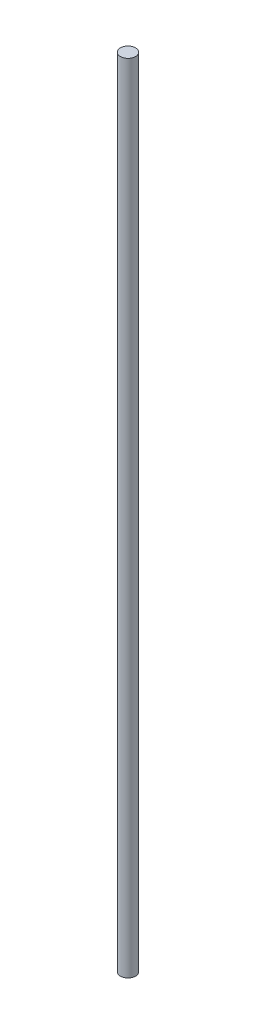
ISO-10303-21;
HEADER;
FILE_DESCRIPTION(('STEP AP214'),'2;1');
FILE_NAME('part.step','',(''),(''),'','','');
FILE_SCHEMA(('AUTOMOTIVE_DESIGN { 1 0 10303 214 1 1 1 1 }'));
ENDSEC;
DATA;
#1=APPLICATION_CONTEXT('core data for automotive mechanical design processes');
#2=APPLICATION_PROTOCOL_DEFINITION('international standard','automotive_design',2000,#1);
#3=PRODUCT_CONTEXT('',#1,'mechanical');
#4=PRODUCT('Part','Part','',(#3));
#5=PRODUCT_RELATED_PRODUCT_CATEGORY('part','',(#4));
#6=PRODUCT_DEFINITION_FORMATION('','',#4);
#7=PRODUCT_DEFINITION_CONTEXT('part definition',#1,'design');
#8=PRODUCT_DEFINITION('design','',#6,#7);
#9=PRODUCT_DEFINITION_SHAPE('','',#8);
#10=(LENGTH_UNIT() NAMED_UNIT(*) SI_UNIT(.MILLI.,.METRE.));
#11=(NAMED_UNIT(*) PLANE_ANGLE_UNIT() SI_UNIT($,.RADIAN.));
#12=(NAMED_UNIT(*) SI_UNIT($,.STERADIAN.) SOLID_ANGLE_UNIT());
#13=UNCERTAINTY_MEASURE_WITH_UNIT(LENGTH_MEASURE(1.E-05),#10,'distance_accuracy_value','');
#14=(GEOMETRIC_REPRESENTATION_CONTEXT(3) GLOBAL_UNCERTAINTY_ASSIGNED_CONTEXT((#13)) GLOBAL_UNIT_ASSIGNED_CONTEXT((#10,
#11,#12)) REPRESENTATION_CONTEXT('',''));
#15=CARTESIAN_POINT('',(0.,0.,0.));
#16=DIRECTION('',(0.,0.,1.));
#17=DIRECTION('',(1.,0.,0.));
#18=AXIS2_PLACEMENT_3D('',#15,#16,#17);
#19=CARTESIAN_POINT('',(0.,500.,0.));
#20=DIRECTION('',(0.,-1.,0.));
#21=DIRECTION('',(0.,0.,-1.));
#22=AXIS2_PLACEMENT_3D('',#19,#20,#21);
#23=CYLINDRICAL_SURFACE('',#22,4.7625);
#24=CARTESIAN_POINT('',(0.,500.,0.));
#25=DIRECTION('',(0.,1.,0.));
#26=DIRECTION('',(0.,0.,1.));
#27=AXIS2_PLACEMENT_3D('',#24,#25,#26);
#28=CIRCLE('',#27,4.7625);
#29=CARTESIAN_POINT('',(0.,500.,4.7625));
#30=VERTEX_POINT('',#29);
#31=EDGE_CURVE('E10',#30,#30,#28,.T.);
#32=ORIENTED_EDGE('',*,*,#31,.F.);
#33=EDGE_LOOP('',(#32));
#34=FACE_BOUND('',#33,.T.);
#35=CARTESIAN_POINT('',(0.,0.,0.));
#36=DIRECTION('',(0.,1.,0.));
#37=DIRECTION('',(0.,0.,1.));
#38=AXIS2_PLACEMENT_3D('',#35,#36,#37);
#39=CIRCLE('',#38,4.7625);
#40=CARTESIAN_POINT('',(0.,0.,4.7625));
#41=VERTEX_POINT('',#40);
#42=EDGE_CURVE('E35',#41,#41,#39,.T.);
#43=ORIENTED_EDGE('',*,*,#42,.T.);
#44=EDGE_LOOP('',(#43));
#45=FACE_BOUND('',#44,.T.);
#46=ADVANCED_FACE('F32',(#34,#45),#23,.T.);
#47=CARTESIAN_POINT('',(0.,500.,0.));
#48=DIRECTION('',(0.,1.,0.));
#49=DIRECTION('',(0.,0.,1.));
#50=AXIS2_PLACEMENT_3D('',#47,#48,#49);
#51=PLANE('',#50);
#52=ORIENTED_EDGE('',*,*,#31,.T.);
#53=EDGE_LOOP('',(#52));
#54=FACE_BOUND('',#53,.T.);
#55=ADVANCED_FACE('F47',(#54),#51,.T.);
#56=CARTESIAN_POINT('',(0.,0.,0.));
#57=DIRECTION('',(0.,1.,0.));
#58=DIRECTION('',(0.,0.,1.));
#59=AXIS2_PLACEMENT_3D('',#56,#57,#58);
#60=PLANE('',#59);
#61=ORIENTED_EDGE('',*,*,#42,.F.);
#62=EDGE_LOOP('',(#61));
#63=FACE_BOUND('',#62,.T.);
#64=ADVANCED_FACE('F45',(#63),#60,.F.);
#65=CLOSED_SHELL('',(#46,#55,#64));
#66=MANIFOLD_SOLID_BREP('B2',#65);
#67=ADVANCED_BREP_SHAPE_REPRESENTATION('',(#18,#66),#14);
#68=SHAPE_DEFINITION_REPRESENTATION(#9,#67);
ENDSEC;
END-ISO-10303-21;
